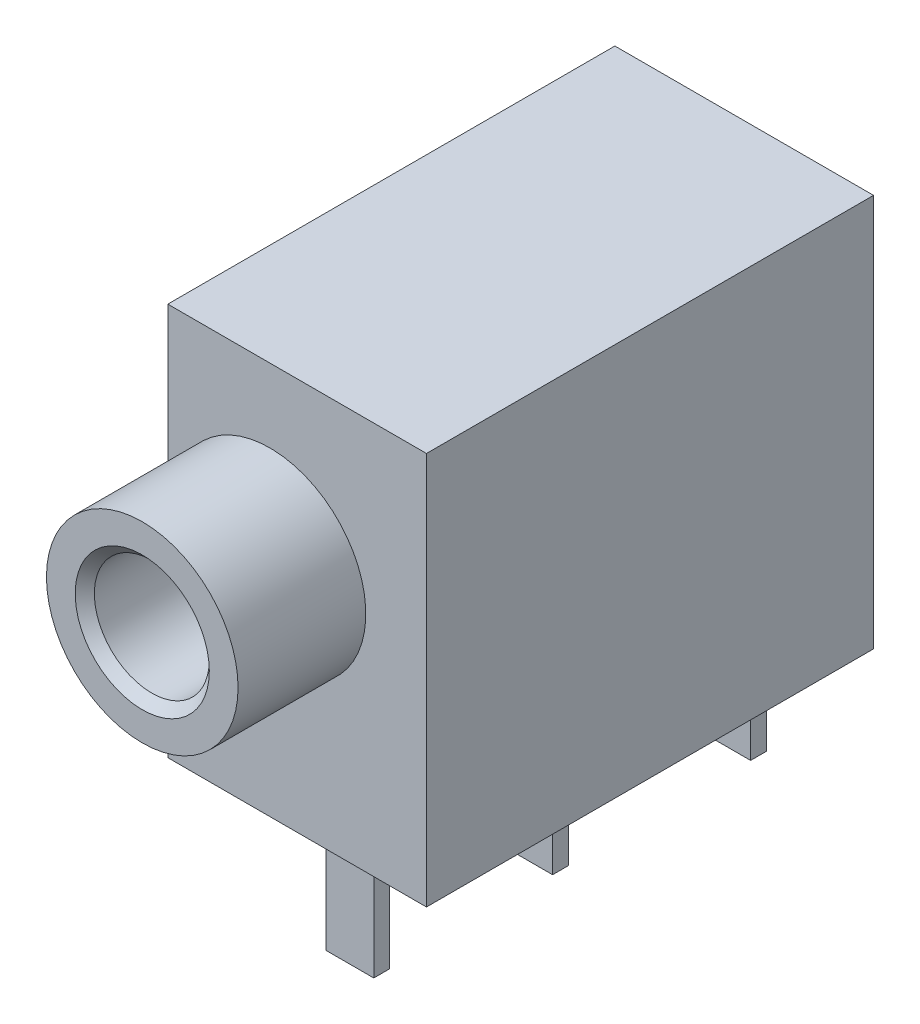
ISO-10303-21;
HEADER;
FILE_DESCRIPTION(('STEP AP214'),'2;1');
FILE_NAME('part.step','',(''),(''),'','','');
FILE_SCHEMA(('AUTOMOTIVE_DESIGN { 1 0 10303 214 1 1 1 1 }'));
ENDSEC;
DATA;
#1=APPLICATION_CONTEXT('core data for automotive mechanical design processes');
#2=APPLICATION_PROTOCOL_DEFINITION('international standard','automotive_design',2000,#1);
#3=PRODUCT_CONTEXT('',#1,'mechanical');
#4=PRODUCT('Part','Part','',(#3));
#5=PRODUCT_RELATED_PRODUCT_CATEGORY('part','',(#4));
#6=PRODUCT_DEFINITION_FORMATION('','',#4);
#7=PRODUCT_DEFINITION_CONTEXT('part definition',#1,'design');
#8=PRODUCT_DEFINITION('design','',#6,#7);
#9=PRODUCT_DEFINITION_SHAPE('','',#8);
#10=(LENGTH_UNIT() NAMED_UNIT(*) SI_UNIT(.MILLI.,.METRE.));
#11=(NAMED_UNIT(*) PLANE_ANGLE_UNIT() SI_UNIT($,.RADIAN.));
#12=(NAMED_UNIT(*) SI_UNIT($,.STERADIAN.) SOLID_ANGLE_UNIT());
#13=UNCERTAINTY_MEASURE_WITH_UNIT(LENGTH_MEASURE(1.E-05),#10,'distance_accuracy_value','');
#14=(GEOMETRIC_REPRESENTATION_CONTEXT(3) GLOBAL_UNCERTAINTY_ASSIGNED_CONTEXT((#13)) GLOBAL_UNIT_ASSIGNED_CONTEXT((#10,
#11,#12)) REPRESENTATION_CONTEXT('',''));
#15=CARTESIAN_POINT('',(0.,0.,0.));
#16=DIRECTION('',(0.,0.,1.));
#17=DIRECTION('',(1.,0.,0.));
#18=AXIS2_PLACEMENT_3D('',#15,#16,#17);
#19=CARTESIAN_POINT('',(-4.05,-6.15,7.));
#20=DIRECTION('',(0.,1.,0.));
#21=DIRECTION('',(0.,0.,1.));
#22=AXIS2_PLACEMENT_3D('',#19,#20,#21);
#23=PLANE('',#22);
#24=DIRECTION('',(0.,0.,-1.));
#25=VECTOR('',#24,1.);
#26=CARTESIAN_POINT('',(-1.85,-6.15,-3.05));
#27=LINE('',#26,#25);
#28=CARTESIAN_POINT('',(-1.85,-6.15,-3.05));
#29=VERTEX_POINT('',#28);
#30=CARTESIAN_POINT('',(-1.85,-6.15,-3.55));
#31=VERTEX_POINT('',#30);
#32=EDGE_CURVE('E215',#29,#31,#27,.T.);
#33=ORIENTED_EDGE('',*,*,#32,.F.);
#34=DIRECTION('',(-1.,0.,0.));
#35=VECTOR('',#34,1.);
#36=CARTESIAN_POINT('',(-1.85,-6.15,-3.05));
#37=LINE('',#36,#35);
#38=CARTESIAN_POINT('',(-0.35,-6.15,-3.05));
#39=VERTEX_POINT('',#38);
#40=EDGE_CURVE('E228',#39,#29,#37,.T.);
#41=ORIENTED_EDGE('',*,*,#40,.F.);
#42=DIRECTION('',(0.,0.,1.));
#43=VECTOR('',#42,1.);
#44=CARTESIAN_POINT('',(-0.35,-6.15,-3.05));
#45=LINE('',#44,#43);
#46=CARTESIAN_POINT('',(-0.35,-6.15,-3.55));
#47=VERTEX_POINT('',#46);
#48=EDGE_CURVE('E237',#47,#39,#45,.T.);
#49=ORIENTED_EDGE('',*,*,#48,.F.);
#50=DIRECTION('',(1.,0.,0.));
#51=VECTOR('',#50,1.);
#52=CARTESIAN_POINT('',(-1.85,-6.15,-3.55));
#53=LINE('',#52,#51);
#54=EDGE_CURVE('E218',#31,#47,#53,.T.);
#55=ORIENTED_EDGE('',*,*,#54,.F.);
#56=EDGE_LOOP('',(#33,#41,#49,#55));
#57=FACE_BOUND('',#56,.T.);
#58=DIRECTION('',(0.,0.,-1.));
#59=VECTOR('',#58,1.);
#60=CARTESIAN_POINT('',(-1.85,-6.15,2.55));
#61=LINE('',#60,#59);
#62=CARTESIAN_POINT('',(-1.85,-6.15,2.55));
#63=VERTEX_POINT('',#62);
#64=CARTESIAN_POINT('',(-1.85,-6.15,2.05));
#65=VERTEX_POINT('',#64);
#66=EDGE_CURVE('E286',#63,#65,#61,.T.);
#67=ORIENTED_EDGE('',*,*,#66,.F.);
#68=DIRECTION('',(-1.,0.,0.));
#69=VECTOR('',#68,1.);
#70=CARTESIAN_POINT('',(-1.85,-6.15,2.55));
#71=LINE('',#70,#69);
#72=CARTESIAN_POINT('',(-0.349999999999997,-6.15,2.55));
#73=VERTEX_POINT('',#72);
#74=EDGE_CURVE('E291',#73,#63,#71,.T.);
#75=ORIENTED_EDGE('',*,*,#74,.F.);
#76=DIRECTION('',(0.,0.,1.));
#77=VECTOR('',#76,1.);
#78=CARTESIAN_POINT('',(-0.349999999999997,-6.15,2.55));
#79=LINE('',#78,#77);
#80=CARTESIAN_POINT('',(-0.349999999999997,-6.15,2.05));
#81=VERTEX_POINT('',#80);
#82=EDGE_CURVE('E303',#81,#73,#79,.T.);
#83=ORIENTED_EDGE('',*,*,#82,.F.);
#84=DIRECTION('',(1.,0.,0.));
#85=VECTOR('',#84,1.);
#86=CARTESIAN_POINT('',(-1.85,-6.15,2.05));
#87=LINE('',#86,#85);
#88=EDGE_CURVE('E300',#65,#81,#87,.T.);
#89=ORIENTED_EDGE('',*,*,#88,.F.);
#90=EDGE_LOOP('',(#67,#75,#83,#89));
#91=FACE_BOUND('',#90,.T.);
#92=DIRECTION('',(1.,0.,0.));
#93=VECTOR('',#92,1.);
#94=CARTESIAN_POINT('',(-4.05,-6.15,-7.));
#95=LINE('',#94,#93);
#96=CARTESIAN_POINT('',(-4.05,-6.15,-7.));
#97=VERTEX_POINT('',#96);
#98=CARTESIAN_POINT('',(4.05,-6.15,-7.));
#99=VERTEX_POINT('',#98);
#100=EDGE_CURVE('E363',#97,#99,#95,.T.);
#101=ORIENTED_EDGE('',*,*,#100,.T.);
#102=DIRECTION('',(0.,0.,-1.));
#103=VECTOR('',#102,1.);
#104=CARTESIAN_POINT('',(4.05,-6.15,7.));
#105=LINE('',#104,#103);
#106=CARTESIAN_POINT('',(4.05,-6.15,7.));
#107=VERTEX_POINT('',#106);
#108=EDGE_CURVE('E369',#107,#99,#105,.T.);
#109=ORIENTED_EDGE('',*,*,#108,.F.);
#110=DIRECTION('',(1.,0.,0.));
#111=VECTOR('',#110,1.);
#112=CARTESIAN_POINT('',(-4.05,-6.15,7.));
#113=LINE('',#112,#111);
#114=CARTESIAN_POINT('',(-4.05,-6.15,7.));
#115=VERTEX_POINT('',#114);
#116=EDGE_CURVE('E367',#115,#107,#113,.T.);
#117=ORIENTED_EDGE('',*,*,#116,.F.);
#118=DIRECTION('',(0.,0.,-1.));
#119=VECTOR('',#118,1.);
#120=CARTESIAN_POINT('',(-4.05,-6.15,7.));
#121=LINE('',#120,#119);
#122=EDGE_CURVE('E379',#115,#97,#121,.T.);
#123=ORIENTED_EDGE('',*,*,#122,.T.);
#124=EDGE_LOOP('',(#101,#109,#117,#123));
#125=FACE_BOUND('',#124,.T.);
#126=DIRECTION('',(0.,0.,-1.));
#127=VECTOR('',#126,1.);
#128=CARTESIAN_POINT('',(0.149999999999999,-6.15,6.25));
#129=LINE('',#128,#127);
#130=CARTESIAN_POINT('',(0.149999999999999,-6.15,6.25));
#131=VERTEX_POINT('',#130);
#132=CARTESIAN_POINT('',(0.149999999999999,-6.15,5.75));
#133=VERTEX_POINT('',#132);
#134=EDGE_CURVE('E319',#131,#133,#129,.T.);
#135=ORIENTED_EDGE('',*,*,#134,.F.);
#136=DIRECTION('',(-1.,0.,0.));
#137=VECTOR('',#136,1.);
#138=CARTESIAN_POINT('',(0.149999999999999,-6.15,6.25));
#139=LINE('',#138,#137);
#140=CARTESIAN_POINT('',(1.65,-6.15,6.25));
#141=VERTEX_POINT('',#140);
#142=EDGE_CURVE('E324',#141,#131,#139,.T.);
#143=ORIENTED_EDGE('',*,*,#142,.F.);
#144=DIRECTION('',(0.,0.,1.));
#145=VECTOR('',#144,1.);
#146=CARTESIAN_POINT('',(1.65,-6.15,6.25));
#147=LINE('',#146,#145);
#148=CARTESIAN_POINT('',(1.65,-6.15,5.75));
#149=VERTEX_POINT('',#148);
#150=EDGE_CURVE('E336',#149,#141,#147,.T.);
#151=ORIENTED_EDGE('',*,*,#150,.F.);
#152=DIRECTION('',(1.,0.,0.));
#153=VECTOR('',#152,1.);
#154=CARTESIAN_POINT('',(0.149999999999999,-6.15,5.75));
#155=LINE('',#154,#153);
#156=EDGE_CURVE('E333',#133,#149,#155,.T.);
#157=ORIENTED_EDGE('',*,*,#156,.F.);
#158=EDGE_LOOP('',(#135,#143,#151,#157));
#159=FACE_BOUND('',#158,.T.);
#160=DIRECTION('',(0.,0.,-1.));
#161=VECTOR('',#160,1.);
#162=CARTESIAN_POINT('',(0.149999999999999,-6.15,0.649999999999999));
#163=LINE('',#162,#161);
#164=CARTESIAN_POINT('',(0.149999999999999,-6.15,0.649999999999999));
#165=VERTEX_POINT('',#164);
#166=CARTESIAN_POINT('',(0.149999999999998,-6.15,0.149999999999999));
#167=VERTEX_POINT('',#166);
#168=EDGE_CURVE('E253',#165,#167,#163,.T.);
#169=ORIENTED_EDGE('',*,*,#168,.F.);
#170=DIRECTION('',(-1.,0.,0.));
#171=VECTOR('',#170,1.);
#172=CARTESIAN_POINT('',(0.149999999999999,-6.15,0.649999999999999));
#173=LINE('',#172,#171);
#174=CARTESIAN_POINT('',(1.65,-6.15,0.65));
#175=VERTEX_POINT('',#174);
#176=EDGE_CURVE('E258',#175,#165,#173,.T.);
#177=ORIENTED_EDGE('',*,*,#176,.F.);
#178=DIRECTION('',(0.,0.,1.));
#179=VECTOR('',#178,1.);
#180=CARTESIAN_POINT('',(1.65,-6.15,0.649999999999999));
#181=LINE('',#180,#179);
#182=CARTESIAN_POINT('',(1.65,-6.15,0.149999999999998));
#183=VERTEX_POINT('',#182);
#184=EDGE_CURVE('E270',#183,#175,#181,.T.);
#185=ORIENTED_EDGE('',*,*,#184,.F.);
#186=DIRECTION('',(1.,0.,0.));
#187=VECTOR('',#186,1.);
#188=CARTESIAN_POINT('',(0.149999999999999,-6.15,0.149999999999999));
#189=LINE('',#188,#187);
#190=EDGE_CURVE('E267',#167,#183,#189,.T.);
#191=ORIENTED_EDGE('',*,*,#190,.F.);
#192=EDGE_LOOP('',(#169,#177,#185,#191));
#193=FACE_BOUND('',#192,.T.);
#194=DIRECTION('',(0.,0.,-1.));
#195=VECTOR('',#194,1.);
#196=CARTESIAN_POINT('',(0.150000000000001,-6.15,-5.55));
#197=LINE('',#196,#195);
#198=CARTESIAN_POINT('',(0.150000000000001,-6.15,-5.55));
#199=VERTEX_POINT('',#198);
#200=CARTESIAN_POINT('',(0.150000000000001,-6.15,-6.05));
#201=VERTEX_POINT('',#200);
#202=EDGE_CURVE('E214',#199,#201,#197,.T.);
#203=ORIENTED_EDGE('',*,*,#202,.F.);
#204=DIRECTION('',(-1.,0.,0.));
#205=VECTOR('',#204,1.);
#206=CARTESIAN_POINT('',(0.150000000000001,-6.15,-5.55));
#207=LINE('',#206,#205);
#208=CARTESIAN_POINT('',(1.65,-6.15,-5.55));
#209=VERTEX_POINT('',#208);
#210=EDGE_CURVE('E211',#209,#199,#207,.T.);
#211=ORIENTED_EDGE('',*,*,#210,.F.);
#212=DIRECTION('',(0.,0.,1.));
#213=VECTOR('',#212,1.);
#214=CARTESIAN_POINT('',(1.65,-6.15,-5.55));
#215=LINE('',#214,#213);
#216=CARTESIAN_POINT('',(1.65,-6.15,-6.05));
#217=VERTEX_POINT('',#216);
#218=EDGE_CURVE('E53',#217,#209,#215,.T.);
#219=ORIENTED_EDGE('',*,*,#218,.F.);
#220=DIRECTION('',(1.,0.,0.));
#221=VECTOR('',#220,1.);
#222=CARTESIAN_POINT('',(0.150000000000001,-6.15,-6.05));
#223=LINE('',#222,#221);
#224=EDGE_CURVE('E48',#201,#217,#223,.T.);
#225=ORIENTED_EDGE('',*,*,#224,.F.);
#226=EDGE_LOOP('',(#203,#211,#219,#225));
#227=FACE_BOUND('',#226,.T.);
#228=ADVANCED_FACE('F33',(#57,#91,#125,#159,#193,#227),#23,.F.);
#229=CARTESIAN_POINT('',(4.05,-6.15,7.));
#230=DIRECTION('',(-1.,0.,0.));
#231=DIRECTION('',(0.,0.,1.));
#232=AXIS2_PLACEMENT_3D('',#229,#230,#231);
#233=PLANE('',#232);
#234=DIRECTION('',(0.,1.,0.));
#235=VECTOR('',#234,1.);
#236=CARTESIAN_POINT('',(4.05,-6.15,-7.));
#237=LINE('',#236,#235);
#238=CARTESIAN_POINT('',(4.05,6.15,-7.));
#239=VERTEX_POINT('',#238);
#240=EDGE_CURVE('E358',#99,#239,#237,.T.);
#241=ORIENTED_EDGE('',*,*,#240,.T.);
#242=DIRECTION('',(0.,0.,-1.));
#243=VECTOR('',#242,1.);
#244=CARTESIAN_POINT('',(4.05,6.15,7.));
#245=LINE('',#244,#243);
#246=CARTESIAN_POINT('',(4.05,6.15,7.));
#247=VERTEX_POINT('',#246);
#248=EDGE_CURVE('E385',#247,#239,#245,.T.);
#249=ORIENTED_EDGE('',*,*,#248,.F.);
#250=DIRECTION('',(0.,1.,0.));
#251=VECTOR('',#250,1.);
#252=CARTESIAN_POINT('',(4.05,-6.15,7.));
#253=LINE('',#252,#251);
#254=EDGE_CURVE('E359',#107,#247,#253,.T.);
#255=ORIENTED_EDGE('',*,*,#254,.F.);
#256=ORIENTED_EDGE('',*,*,#108,.T.);
#257=EDGE_LOOP('',(#241,#249,#255,#256));
#258=FACE_BOUND('',#257,.T.);
#259=ADVANCED_FACE('F411',(#258),#233,.F.);
#260=CARTESIAN_POINT('',(-4.05,6.15,7.));
#261=DIRECTION('',(0.,-1.,0.));
#262=DIRECTION('',(0.,0.,-1.));
#263=AXIS2_PLACEMENT_3D('',#260,#261,#262);
#264=PLANE('',#263);
#265=DIRECTION('',(-1.,0.,0.));
#266=VECTOR('',#265,1.);
#267=CARTESIAN_POINT('',(-4.05,6.15,-7.));
#268=LINE('',#267,#266);
#269=CARTESIAN_POINT('',(-4.05,6.15,-7.));
#270=VERTEX_POINT('',#269);
#271=EDGE_CURVE('E372',#239,#270,#268,.T.);
#272=ORIENTED_EDGE('',*,*,#271,.T.);
#273=DIRECTION('',(0.,0.,-1.));
#274=VECTOR('',#273,1.);
#275=CARTESIAN_POINT('',(-4.05,6.15,7.));
#276=LINE('',#275,#274);
#277=CARTESIAN_POINT('',(-4.05,6.15,7.));
#278=VERTEX_POINT('',#277);
#279=EDGE_CURVE('E382',#278,#270,#276,.T.);
#280=ORIENTED_EDGE('',*,*,#279,.F.);
#281=DIRECTION('',(-1.,0.,0.));
#282=VECTOR('',#281,1.);
#283=CARTESIAN_POINT('',(-4.05,6.15,7.));
#284=LINE('',#283,#282);
#285=EDGE_CURVE('E362',#247,#278,#284,.T.);
#286=ORIENTED_EDGE('',*,*,#285,.F.);
#287=ORIENTED_EDGE('',*,*,#248,.T.);
#288=EDGE_LOOP('',(#272,#280,#286,#287));
#289=FACE_BOUND('',#288,.T.);
#290=ADVANCED_FACE('F417',(#289),#264,.F.);
#291=CARTESIAN_POINT('',(-4.05,-6.15,7.));
#292=DIRECTION('',(1.,0.,0.));
#293=DIRECTION('',(0.,0.,-1.));
#294=AXIS2_PLACEMENT_3D('',#291,#292,#293);
#295=PLANE('',#294);
#296=DIRECTION('',(0.,-1.,0.));
#297=VECTOR('',#296,1.);
#298=CARTESIAN_POINT('',(-4.05,-6.15,-7.));
#299=LINE('',#298,#297);
#300=EDGE_CURVE('E374',#270,#97,#299,.T.);
#301=ORIENTED_EDGE('',*,*,#300,.T.);
#302=ORIENTED_EDGE('',*,*,#122,.F.);
#303=DIRECTION('',(0.,-1.,0.));
#304=VECTOR('',#303,1.);
#305=CARTESIAN_POINT('',(-4.05,-6.15,7.));
#306=LINE('',#305,#304);
#307=EDGE_CURVE('E365',#278,#115,#306,.T.);
#308=ORIENTED_EDGE('',*,*,#307,.F.);
#309=ORIENTED_EDGE('',*,*,#279,.T.);
#310=EDGE_LOOP('',(#301,#302,#308,#309));
#311=FACE_BOUND('',#310,.T.);
#312=ADVANCED_FACE('F424',(#311),#295,.F.);
#313=CARTESIAN_POINT('',(0.,0.,7.));
#314=DIRECTION('',(0.,0.,-1.));
#315=DIRECTION('',(-1.,0.,0.));
#316=AXIS2_PLACEMENT_3D('',#313,#314,#315);
#317=PLANE('',#316);
#318=CARTESIAN_POINT('',(-0.85,0.849999999999999,7.));
#319=DIRECTION('',(0.,0.,-1.));
#320=DIRECTION('',(-1.,0.,0.));
#321=AXIS2_PLACEMENT_3D('',#318,#319,#320);
#322=CIRCLE('',#321,3.);
#323=CARTESIAN_POINT('',(-3.85,0.849999999999999,7.));
#324=VERTEX_POINT('',#323);
#325=EDGE_CURVE('E388',#324,#324,#322,.F.);
#326=ORIENTED_EDGE('',*,*,#325,.F.);
#327=EDGE_LOOP('',(#326));
#328=FACE_BOUND('',#327,.T.);
#329=ORIENTED_EDGE('',*,*,#254,.T.);
#330=ORIENTED_EDGE('',*,*,#285,.T.);
#331=ORIENTED_EDGE('',*,*,#307,.T.);
#332=ORIENTED_EDGE('',*,*,#116,.T.);
#333=EDGE_LOOP('',(#329,#330,#331,#332));
#334=FACE_BOUND('',#333,.T.);
#335=ADVANCED_FACE('F427',(#328,#334),#317,.F.);
#336=CARTESIAN_POINT('',(0.,0.,-7.));
#337=DIRECTION('',(0.,0.,-1.));
#338=DIRECTION('',(-1.,0.,0.));
#339=AXIS2_PLACEMENT_3D('',#336,#337,#338);
#340=PLANE('',#339);
#341=ORIENTED_EDGE('',*,*,#240,.F.);
#342=ORIENTED_EDGE('',*,*,#100,.F.);
#343=ORIENTED_EDGE('',*,*,#300,.F.);
#344=ORIENTED_EDGE('',*,*,#271,.F.);
#345=EDGE_LOOP('',(#341,#342,#343,#344));
#346=FACE_BOUND('',#345,.T.);
#347=ADVANCED_FACE('F422',(#346),#340,.T.);
#348=CARTESIAN_POINT('',(-0.85,0.849999999999999,11.));
#349=DIRECTION('',(0.,0.,-1.));
#350=DIRECTION('',(-1.,0.,0.));
#351=AXIS2_PLACEMENT_3D('',#348,#349,#350);
#352=CYLINDRICAL_SURFACE('',#351,3.);
#353=CARTESIAN_POINT('',(-0.85,0.849999999999999,11.));
#354=DIRECTION('',(0.,0.,1.));
#355=DIRECTION('',(1.,0.,0.));
#356=AXIS2_PLACEMENT_3D('',#353,#354,#355);
#357=CIRCLE('',#356,3.);
#358=CARTESIAN_POINT('',(2.15,0.849999999999999,11.));
#359=VERTEX_POINT('',#358);
#360=EDGE_CURVE('E355',#359,#359,#357,.T.);
#361=ORIENTED_EDGE('',*,*,#360,.F.);
#362=EDGE_LOOP('',(#361));
#363=FACE_BOUND('',#362,.T.);
#364=ORIENTED_EDGE('',*,*,#325,.T.);
#365=EDGE_LOOP('',(#364));
#366=FACE_BOUND('',#365,.T.);
#367=ADVANCED_FACE('F452',(#363,#366),#352,.T.);
#368=CARTESIAN_POINT('',(-0.85,0.849999999999999,11.));
#369=DIRECTION('',(0.,0.,1.));
#370=DIRECTION('',(1.,0.,0.));
#371=AXIS2_PLACEMENT_3D('',#368,#369,#370);
#372=PLANE('',#371);
#373=CARTESIAN_POINT('',(-0.85,0.849999999999999,11.));
#374=DIRECTION('',(0.,0.,1.));
#375=DIRECTION('',(1.,0.,0.));
#376=AXIS2_PLACEMENT_3D('',#373,#374,#375);
#377=CIRCLE('',#376,2.1);
#378=CARTESIAN_POINT('',(1.25000000000001,0.849999999999999,11.));
#379=VERTEX_POINT('',#378);
#380=EDGE_CURVE('E11',#379,#379,#377,.F.);
#381=ORIENTED_EDGE('',*,*,#380,.T.);
#382=EDGE_LOOP('',(#381));
#383=FACE_BOUND('',#382,.T.);
#384=ORIENTED_EDGE('',*,*,#360,.T.);
#385=EDGE_LOOP('',(#384));
#386=FACE_BOUND('',#385,.T.);
#387=ADVANCED_FACE('F457',(#383,#386),#372,.T.);
#388=CARTESIAN_POINT('',(-0.85,0.849999999999999,-3.));
#389=DIRECTION('',(0.,0.,1.));
#390=DIRECTION('',(1.,0.,0.));
#391=AXIS2_PLACEMENT_3D('',#388,#389,#390);
#392=CYLINDRICAL_SURFACE('',#391,1.8);
#393=CARTESIAN_POINT('',(-0.85,0.849999999999999,10.7));
#394=DIRECTION('',(0.,0.,1.));
#395=DIRECTION('',(1.,0.,0.));
#396=AXIS2_PLACEMENT_3D('',#393,#394,#395);
#397=CIRCLE('',#396,1.8);
#398=CARTESIAN_POINT('',(0.95,0.849999999999999,10.7));
#399=VERTEX_POINT('',#398);
#400=EDGE_CURVE('E41',#399,#399,#397,.T.);
#401=ORIENTED_EDGE('',*,*,#400,.T.);
#402=EDGE_LOOP('',(#401));
#403=FACE_BOUND('',#402,.T.);
#404=CARTESIAN_POINT('',(-0.85,0.849999999999999,-3.));
#405=DIRECTION('',(0.,0.,1.));
#406=DIRECTION('',(1.,0.,0.));
#407=AXIS2_PLACEMENT_3D('',#404,#405,#406);
#408=CIRCLE('',#407,1.8);
#409=CARTESIAN_POINT('',(0.95,0.849999999999999,-3.));
#410=VERTEX_POINT('',#409);
#411=EDGE_CURVE('E352',#410,#410,#408,.T.);
#412=ORIENTED_EDGE('',*,*,#411,.F.);
#413=EDGE_LOOP('',(#412));
#414=FACE_BOUND('',#413,.T.);
#415=ADVANCED_FACE('F393',(#403,#414),#392,.F.);
#416=CARTESIAN_POINT('',(-0.85,0.849999999999999,-3.));
#417=DIRECTION('',(0.,0.,1.));
#418=DIRECTION('',(1.,0.,0.));
#419=AXIS2_PLACEMENT_3D('',#416,#417,#418);
#420=PLANE('',#419);
#421=ORIENTED_EDGE('',*,*,#411,.T.);
#422=EDGE_LOOP('',(#421));
#423=FACE_BOUND('',#422,.T.);
#424=ADVANCED_FACE('F398',(#423),#420,.T.);
#425=CARTESIAN_POINT('',(-0.85,0.849999999999999,10.7));
#426=DIRECTION('',(0.,0.,1.));
#427=DIRECTION('',(1.,0.,0.));
#428=AXIS2_PLACEMENT_3D('',#425,#426,#427);
#429=CONICAL_SURFACE('',#428,1.8,0.785398163397454);
#430=ORIENTED_EDGE('',*,*,#380,.F.);
#431=EDGE_LOOP('',(#430));
#432=FACE_BOUND('',#431,.T.);
#433=ORIENTED_EDGE('',*,*,#400,.F.);
#434=EDGE_LOOP('',(#433));
#435=FACE_BOUND('',#434,.T.);
#436=ADVANCED_FACE('F35',(#432,#435),#429,.F.);
#437=CARTESIAN_POINT('',(0.149999999999999,-9.65,6.25));
#438=DIRECTION('',(1.,0.,0.));
#439=DIRECTION('',(0.,0.,-1.));
#440=AXIS2_PLACEMENT_3D('',#437,#438,#439);
#441=PLANE('',#440);
#442=ORIENTED_EDGE('',*,*,#134,.T.);
#443=DIRECTION('',(0.,1.,0.));
#444=VECTOR('',#443,1.);
#445=CARTESIAN_POINT('',(0.149999999999999,-9.65,5.75));
#446=LINE('',#445,#444);
#447=CARTESIAN_POINT('',(0.149999999999999,-9.65,5.75));
#448=VERTEX_POINT('',#447);
#449=EDGE_CURVE('E349',#448,#133,#446,.T.);
#450=ORIENTED_EDGE('',*,*,#449,.F.);
#451=DIRECTION('',(0.,0.,-1.));
#452=VECTOR('',#451,1.);
#453=CARTESIAN_POINT('',(0.149999999999999,-9.65,6.25));
#454=LINE('',#453,#452);
#455=CARTESIAN_POINT('',(0.149999999999999,-9.65,6.25));
#456=VERTEX_POINT('',#455);
#457=EDGE_CURVE('E320',#456,#448,#454,.T.);
#458=ORIENTED_EDGE('',*,*,#457,.F.);
#459=DIRECTION('',(0.,1.,0.));
#460=VECTOR('',#459,1.);
#461=CARTESIAN_POINT('',(0.149999999999999,-9.65,6.25));
#462=LINE('',#461,#460);
#463=EDGE_CURVE('E330',#456,#131,#462,.T.);
#464=ORIENTED_EDGE('',*,*,#463,.T.);
#465=EDGE_LOOP('',(#442,#450,#458,#464));
#466=FACE_BOUND('',#465,.T.);
#467=ADVANCED_FACE('F397',(#466),#441,.F.);
#468=CARTESIAN_POINT('',(0.149999999999999,-9.65,5.75));
#469=DIRECTION('',(0.,0.,1.));
#470=DIRECTION('',(1.,0.,0.));
#471=AXIS2_PLACEMENT_3D('',#468,#469,#470);
#472=PLANE('',#471);
#473=ORIENTED_EDGE('',*,*,#156,.T.);
#474=DIRECTION('',(0.,1.,0.));
#475=VECTOR('',#474,1.);
#476=CARTESIAN_POINT('',(1.65,-9.65,5.75));
#477=LINE('',#476,#475);
#478=CARTESIAN_POINT('',(1.65,-9.65,5.75));
#479=VERTEX_POINT('',#478);
#480=EDGE_CURVE('E346',#479,#149,#477,.T.);
#481=ORIENTED_EDGE('',*,*,#480,.F.);
#482=DIRECTION('',(1.,0.,0.));
#483=VECTOR('',#482,1.);
#484=CARTESIAN_POINT('',(0.149999999999999,-9.65,5.75));
#485=LINE('',#484,#483);
#486=EDGE_CURVE('E323',#448,#479,#485,.T.);
#487=ORIENTED_EDGE('',*,*,#486,.F.);
#488=ORIENTED_EDGE('',*,*,#449,.T.);
#489=EDGE_LOOP('',(#473,#481,#487,#488));
#490=FACE_BOUND('',#489,.T.);
#491=ADVANCED_FACE('F404',(#490),#472,.F.);
#492=CARTESIAN_POINT('',(1.65,-9.65,6.25));
#493=DIRECTION('',(-1.,0.,0.));
#494=DIRECTION('',(0.,0.,1.));
#495=AXIS2_PLACEMENT_3D('',#492,#493,#494);
#496=PLANE('',#495);
#497=ORIENTED_EDGE('',*,*,#150,.T.);
#498=DIRECTION('',(0.,1.,0.));
#499=VECTOR('',#498,1.);
#500=CARTESIAN_POINT('',(1.65,-9.65,6.25));
#501=LINE('',#500,#499);
#502=CARTESIAN_POINT('',(1.65,-9.65,6.25));
#503=VERTEX_POINT('',#502);
#504=EDGE_CURVE('E343',#503,#141,#501,.T.);
#505=ORIENTED_EDGE('',*,*,#504,.F.);
#506=DIRECTION('',(0.,0.,1.));
#507=VECTOR('',#506,1.);
#508=CARTESIAN_POINT('',(1.65,-9.65,6.25));
#509=LINE('',#508,#507);
#510=EDGE_CURVE('E326',#479,#503,#509,.T.);
#511=ORIENTED_EDGE('',*,*,#510,.F.);
#512=ORIENTED_EDGE('',*,*,#480,.T.);
#513=EDGE_LOOP('',(#497,#505,#511,#512));
#514=FACE_BOUND('',#513,.T.);
#515=ADVANCED_FACE('F466',(#514),#496,.F.);
#516=CARTESIAN_POINT('',(0.149999999999999,-9.65,6.25));
#517=DIRECTION('',(0.,0.,-1.));
#518=DIRECTION('',(-1.,0.,0.));
#519=AXIS2_PLACEMENT_3D('',#516,#517,#518);
#520=PLANE('',#519);
#521=ORIENTED_EDGE('',*,*,#142,.T.);
#522=ORIENTED_EDGE('',*,*,#463,.F.);
#523=DIRECTION('',(-1.,0.,0.));
#524=VECTOR('',#523,1.);
#525=CARTESIAN_POINT('',(0.149999999999999,-9.65,6.25));
#526=LINE('',#525,#524);
#527=EDGE_CURVE('E328',#503,#456,#526,.T.);
#528=ORIENTED_EDGE('',*,*,#527,.F.);
#529=ORIENTED_EDGE('',*,*,#504,.T.);
#530=EDGE_LOOP('',(#521,#522,#528,#529));
#531=FACE_BOUND('',#530,.T.);
#532=ADVANCED_FACE('F470',(#531),#520,.F.);
#533=CARTESIAN_POINT('',(0.,-9.65,0.));
#534=DIRECTION('',(0.,-1.,0.));
#535=DIRECTION('',(0.,0.,-1.));
#536=AXIS2_PLACEMENT_3D('',#533,#534,#535);
#537=PLANE('',#536);
#538=ORIENTED_EDGE('',*,*,#457,.T.);
#539=ORIENTED_EDGE('',*,*,#486,.T.);
#540=ORIENTED_EDGE('',*,*,#510,.T.);
#541=ORIENTED_EDGE('',*,*,#527,.T.);
#542=EDGE_LOOP('',(#538,#539,#540,#541));
#543=FACE_BOUND('',#542,.T.);
#544=ADVANCED_FACE('F474',(#543),#537,.T.);
#545=CARTESIAN_POINT('',(-1.85,-9.65,2.55));
#546=DIRECTION('',(1.,0.,0.));
#547=DIRECTION('',(0.,0.,-1.));
#548=AXIS2_PLACEMENT_3D('',#545,#546,#547);
#549=PLANE('',#548);
#550=ORIENTED_EDGE('',*,*,#66,.T.);
#551=DIRECTION('',(0.,1.,0.));
#552=VECTOR('',#551,1.);
#553=CARTESIAN_POINT('',(-1.85,-9.65,2.05));
#554=LINE('',#553,#552);
#555=CARTESIAN_POINT('',(-1.85,-9.65,2.05));
#556=VERTEX_POINT('',#555);
#557=EDGE_CURVE('E316',#556,#65,#554,.T.);
#558=ORIENTED_EDGE('',*,*,#557,.F.);
#559=DIRECTION('',(0.,0.,-1.));
#560=VECTOR('',#559,1.);
#561=CARTESIAN_POINT('',(-1.85,-9.65,2.55));
#562=LINE('',#561,#560);
#563=CARTESIAN_POINT('',(-1.85,-9.65,2.55));
#564=VERTEX_POINT('',#563);
#565=EDGE_CURVE('E287',#564,#556,#562,.T.);
#566=ORIENTED_EDGE('',*,*,#565,.F.);
#567=DIRECTION('',(0.,1.,0.));
#568=VECTOR('',#567,1.);
#569=CARTESIAN_POINT('',(-1.85,-9.65,2.55));
#570=LINE('',#569,#568);
#571=EDGE_CURVE('E297',#564,#63,#570,.T.);
#572=ORIENTED_EDGE('',*,*,#571,.T.);
#573=EDGE_LOOP('',(#550,#558,#566,#572));
#574=FACE_BOUND('',#573,.T.);
#575=ADVANCED_FACE('F478',(#574),#549,.F.);
#576=CARTESIAN_POINT('',(-1.85,-9.65,2.05));
#577=DIRECTION('',(0.,0.,1.));
#578=DIRECTION('',(1.,0.,0.));
#579=AXIS2_PLACEMENT_3D('',#576,#577,#578);
#580=PLANE('',#579);
#581=ORIENTED_EDGE('',*,*,#88,.T.);
#582=DIRECTION('',(0.,1.,0.));
#583=VECTOR('',#582,1.);
#584=CARTESIAN_POINT('',(-0.349999999999997,-9.65,2.05));
#585=LINE('',#584,#583);
#586=CARTESIAN_POINT('',(-0.349999999999997,-9.65,2.05));
#587=VERTEX_POINT('',#586);
#588=EDGE_CURVE('E313',#587,#81,#585,.T.);
#589=ORIENTED_EDGE('',*,*,#588,.F.);
#590=DIRECTION('',(1.,0.,0.));
#591=VECTOR('',#590,1.);
#592=CARTESIAN_POINT('',(-1.85,-9.65,2.05));
#593=LINE('',#592,#591);
#594=EDGE_CURVE('E290',#556,#587,#593,.T.);
#595=ORIENTED_EDGE('',*,*,#594,.F.);
#596=ORIENTED_EDGE('',*,*,#557,.T.);
#597=EDGE_LOOP('',(#581,#589,#595,#596));
#598=FACE_BOUND('',#597,.T.);
#599=ADVANCED_FACE('F482',(#598),#580,.F.);
#600=CARTESIAN_POINT('',(-0.349999999999997,-9.65,2.55));
#601=DIRECTION('',(-1.,0.,0.));
#602=DIRECTION('',(0.,0.,1.));
#603=AXIS2_PLACEMENT_3D('',#600,#601,#602);
#604=PLANE('',#603);
#605=ORIENTED_EDGE('',*,*,#82,.T.);
#606=DIRECTION('',(0.,1.,0.));
#607=VECTOR('',#606,1.);
#608=CARTESIAN_POINT('',(-0.349999999999997,-9.65,2.55));
#609=LINE('',#608,#607);
#610=CARTESIAN_POINT('',(-0.349999999999997,-9.65,2.55));
#611=VERTEX_POINT('',#610);
#612=EDGE_CURVE('E310',#611,#73,#609,.T.);
#613=ORIENTED_EDGE('',*,*,#612,.F.);
#614=DIRECTION('',(0.,0.,1.));
#615=VECTOR('',#614,1.);
#616=CARTESIAN_POINT('',(-0.349999999999997,-9.65,2.55));
#617=LINE('',#616,#615);
#618=EDGE_CURVE('E293',#587,#611,#617,.T.);
#619=ORIENTED_EDGE('',*,*,#618,.F.);
#620=ORIENTED_EDGE('',*,*,#588,.T.);
#621=EDGE_LOOP('',(#605,#613,#619,#620));
#622=FACE_BOUND('',#621,.T.);
#623=ADVANCED_FACE('F486',(#622),#604,.F.);
#624=CARTESIAN_POINT('',(-1.85,-9.65,2.55));
#625=DIRECTION('',(0.,0.,-1.));
#626=DIRECTION('',(-1.,0.,0.));
#627=AXIS2_PLACEMENT_3D('',#624,#625,#626);
#628=PLANE('',#627);
#629=ORIENTED_EDGE('',*,*,#74,.T.);
#630=ORIENTED_EDGE('',*,*,#571,.F.);
#631=DIRECTION('',(-1.,0.,0.));
#632=VECTOR('',#631,1.);
#633=CARTESIAN_POINT('',(-1.85,-9.65,2.55));
#634=LINE('',#633,#632);
#635=EDGE_CURVE('E295',#611,#564,#634,.T.);
#636=ORIENTED_EDGE('',*,*,#635,.F.);
#637=ORIENTED_EDGE('',*,*,#612,.T.);
#638=EDGE_LOOP('',(#629,#630,#636,#637));
#639=FACE_BOUND('',#638,.T.);
#640=ADVANCED_FACE('F490',(#639),#628,.F.);
#641=CARTESIAN_POINT('',(0.,-9.65,0.));
#642=DIRECTION('',(0.,-1.,0.));
#643=DIRECTION('',(0.,0.,-1.));
#644=AXIS2_PLACEMENT_3D('',#641,#642,#643);
#645=PLANE('',#644);
#646=ORIENTED_EDGE('',*,*,#565,.T.);
#647=ORIENTED_EDGE('',*,*,#594,.T.);
#648=ORIENTED_EDGE('',*,*,#618,.T.);
#649=ORIENTED_EDGE('',*,*,#635,.T.);
#650=EDGE_LOOP('',(#646,#647,#648,#649));
#651=FACE_BOUND('',#650,.T.);
#652=ADVANCED_FACE('F494',(#651),#645,.T.);
#653=CARTESIAN_POINT('',(0.149999999999999,-9.65,0.649999999999999));
#654=DIRECTION('',(1.,0.,0.));
#655=DIRECTION('',(0.,0.,-1.));
#656=AXIS2_PLACEMENT_3D('',#653,#654,#655);
#657=PLANE('',#656);
#658=ORIENTED_EDGE('',*,*,#168,.T.);
#659=DIRECTION('',(0.,1.,0.));
#660=VECTOR('',#659,1.);
#661=CARTESIAN_POINT('',(0.149999999999999,-9.65,0.149999999999999));
#662=LINE('',#661,#660);
#663=CARTESIAN_POINT('',(0.149999999999999,-9.65,0.149999999999999));
#664=VERTEX_POINT('',#663);
#665=EDGE_CURVE('E283',#664,#167,#662,.T.);
#666=ORIENTED_EDGE('',*,*,#665,.F.);
#667=DIRECTION('',(0.,0.,-1.));
#668=VECTOR('',#667,1.);
#669=CARTESIAN_POINT('',(0.149999999999999,-9.65,0.649999999999999));
#670=LINE('',#669,#668);
#671=CARTESIAN_POINT('',(0.149999999999999,-9.65,0.649999999999999));
#672=VERTEX_POINT('',#671);
#673=EDGE_CURVE('E254',#672,#664,#670,.T.);
#674=ORIENTED_EDGE('',*,*,#673,.F.);
#675=DIRECTION('',(0.,1.,0.));
#676=VECTOR('',#675,1.);
#677=CARTESIAN_POINT('',(0.149999999999999,-9.65,0.649999999999999));
#678=LINE('',#677,#676);
#679=EDGE_CURVE('E264',#672,#165,#678,.T.);
#680=ORIENTED_EDGE('',*,*,#679,.T.);
#681=EDGE_LOOP('',(#658,#666,#674,#680));
#682=FACE_BOUND('',#681,.T.);
#683=ADVANCED_FACE('F498',(#682),#657,.F.);
#684=CARTESIAN_POINT('',(0.149999999999999,-9.65,0.149999999999999));
#685=DIRECTION('',(0.,0.,1.));
#686=DIRECTION('',(1.,0.,0.));
#687=AXIS2_PLACEMENT_3D('',#684,#685,#686);
#688=PLANE('',#687);
#689=ORIENTED_EDGE('',*,*,#190,.T.);
#690=DIRECTION('',(0.,1.,0.));
#691=VECTOR('',#690,1.);
#692=CARTESIAN_POINT('',(1.65,-9.65,0.149999999999999));
#693=LINE('',#692,#691);
#694=CARTESIAN_POINT('',(1.65,-9.65,0.149999999999999));
#695=VERTEX_POINT('',#694);
#696=EDGE_CURVE('E280',#695,#183,#693,.T.);
#697=ORIENTED_EDGE('',*,*,#696,.F.);
#698=DIRECTION('',(1.,0.,0.));
#699=VECTOR('',#698,1.);
#700=CARTESIAN_POINT('',(0.149999999999999,-9.65,0.149999999999999));
#701=LINE('',#700,#699);
#702=EDGE_CURVE('E257',#664,#695,#701,.T.);
#703=ORIENTED_EDGE('',*,*,#702,.F.);
#704=ORIENTED_EDGE('',*,*,#665,.T.);
#705=EDGE_LOOP('',(#689,#697,#703,#704));
#706=FACE_BOUND('',#705,.T.);
#707=ADVANCED_FACE('F502',(#706),#688,.F.);
#708=CARTESIAN_POINT('',(1.65,-9.65,0.649999999999999));
#709=DIRECTION('',(-1.,0.,0.));
#710=DIRECTION('',(0.,0.,1.));
#711=AXIS2_PLACEMENT_3D('',#708,#709,#710);
#712=PLANE('',#711);
#713=ORIENTED_EDGE('',*,*,#184,.T.);
#714=DIRECTION('',(0.,1.,0.));
#715=VECTOR('',#714,1.);
#716=CARTESIAN_POINT('',(1.65,-9.65,0.649999999999999));
#717=LINE('',#716,#715);
#718=CARTESIAN_POINT('',(1.65,-9.65,0.649999999999999));
#719=VERTEX_POINT('',#718);
#720=EDGE_CURVE('E277',#719,#175,#717,.T.);
#721=ORIENTED_EDGE('',*,*,#720,.F.);
#722=DIRECTION('',(0.,0.,1.));
#723=VECTOR('',#722,1.);
#724=CARTESIAN_POINT('',(1.65,-9.65,0.649999999999999));
#725=LINE('',#724,#723);
#726=EDGE_CURVE('E260',#695,#719,#725,.T.);
#727=ORIENTED_EDGE('',*,*,#726,.F.);
#728=ORIENTED_EDGE('',*,*,#696,.T.);
#729=EDGE_LOOP('',(#713,#721,#727,#728));
#730=FACE_BOUND('',#729,.T.);
#731=ADVANCED_FACE('F506',(#730),#712,.F.);
#732=CARTESIAN_POINT('',(0.149999999999999,-9.65,0.649999999999999));
#733=DIRECTION('',(0.,0.,-1.));
#734=DIRECTION('',(-1.,0.,0.));
#735=AXIS2_PLACEMENT_3D('',#732,#733,#734);
#736=PLANE('',#735);
#737=ORIENTED_EDGE('',*,*,#176,.T.);
#738=ORIENTED_EDGE('',*,*,#679,.F.);
#739=DIRECTION('',(-1.,0.,0.));
#740=VECTOR('',#739,1.);
#741=CARTESIAN_POINT('',(0.149999999999999,-9.65,0.649999999999999));
#742=LINE('',#741,#740);
#743=EDGE_CURVE('E262',#719,#672,#742,.T.);
#744=ORIENTED_EDGE('',*,*,#743,.F.);
#745=ORIENTED_EDGE('',*,*,#720,.T.);
#746=EDGE_LOOP('',(#737,#738,#744,#745));
#747=FACE_BOUND('',#746,.T.);
#748=ADVANCED_FACE('F510',(#747),#736,.F.);
#749=CARTESIAN_POINT('',(0.,-9.65,0.));
#750=DIRECTION('',(0.,-1.,0.));
#751=DIRECTION('',(0.,0.,-1.));
#752=AXIS2_PLACEMENT_3D('',#749,#750,#751);
#753=PLANE('',#752);
#754=ORIENTED_EDGE('',*,*,#673,.T.);
#755=ORIENTED_EDGE('',*,*,#702,.T.);
#756=ORIENTED_EDGE('',*,*,#726,.T.);
#757=ORIENTED_EDGE('',*,*,#743,.T.);
#758=EDGE_LOOP('',(#754,#755,#756,#757));
#759=FACE_BOUND('',#758,.T.);
#760=ADVANCED_FACE('F514',(#759),#753,.T.);
#761=CARTESIAN_POINT('',(-1.85,-9.65,-3.05));
#762=DIRECTION('',(1.,0.,0.));
#763=DIRECTION('',(0.,0.,-1.));
#764=AXIS2_PLACEMENT_3D('',#761,#762,#763);
#765=PLANE('',#764);
#766=ORIENTED_EDGE('',*,*,#32,.T.);
#767=DIRECTION('',(0.,1.,0.));
#768=VECTOR('',#767,1.);
#769=CARTESIAN_POINT('',(-1.85,-9.65,-3.55));
#770=LINE('',#769,#768);
#771=CARTESIAN_POINT('',(-1.85,-9.65,-3.55));
#772=VERTEX_POINT('',#771);
#773=EDGE_CURVE('E250',#772,#31,#770,.T.);
#774=ORIENTED_EDGE('',*,*,#773,.F.);
#775=DIRECTION('',(0.,0.,-1.));
#776=VECTOR('',#775,1.);
#777=CARTESIAN_POINT('',(-1.85,-9.65,-3.05));
#778=LINE('',#777,#776);
#779=CARTESIAN_POINT('',(-1.85,-9.65,-3.05));
#780=VERTEX_POINT('',#779);
#781=EDGE_CURVE('E224',#780,#772,#778,.T.);
#782=ORIENTED_EDGE('',*,*,#781,.F.);
#783=DIRECTION('',(0.,1.,0.));
#784=VECTOR('',#783,1.);
#785=CARTESIAN_POINT('',(-1.85,-9.65,-3.05));
#786=LINE('',#785,#784);
#787=EDGE_CURVE('E233',#780,#29,#786,.T.);
#788=ORIENTED_EDGE('',*,*,#787,.T.);
#789=EDGE_LOOP('',(#766,#774,#782,#788));
#790=FACE_BOUND('',#789,.T.);
#791=ADVANCED_FACE('F518',(#790),#765,.F.);
#792=CARTESIAN_POINT('',(-1.85,-9.65,-3.55));
#793=DIRECTION('',(0.,0.,1.));
#794=DIRECTION('',(1.,0.,0.));
#795=AXIS2_PLACEMENT_3D('',#792,#793,#794);
#796=PLANE('',#795);
#797=ORIENTED_EDGE('',*,*,#54,.T.);
#798=DIRECTION('',(0.,1.,0.));
#799=VECTOR('',#798,1.);
#800=CARTESIAN_POINT('',(-0.35,-9.65,-3.55));
#801=LINE('',#800,#799);
#802=CARTESIAN_POINT('',(-0.35,-9.65,-3.55));
#803=VERTEX_POINT('',#802);
#804=EDGE_CURVE('E247',#803,#47,#801,.T.);
#805=ORIENTED_EDGE('',*,*,#804,.F.);
#806=DIRECTION('',(1.,0.,0.));
#807=VECTOR('',#806,1.);
#808=CARTESIAN_POINT('',(-1.85,-9.65,-3.55));
#809=LINE('',#808,#807);
#810=EDGE_CURVE('E227',#772,#803,#809,.T.);
#811=ORIENTED_EDGE('',*,*,#810,.F.);
#812=ORIENTED_EDGE('',*,*,#773,.T.);
#813=EDGE_LOOP('',(#797,#805,#811,#812));
#814=FACE_BOUND('',#813,.T.);
#815=ADVANCED_FACE('F522',(#814),#796,.F.);
#816=CARTESIAN_POINT('',(-0.35,-9.65,-3.05));
#817=DIRECTION('',(-1.,0.,0.));
#818=DIRECTION('',(0.,0.,1.));
#819=AXIS2_PLACEMENT_3D('',#816,#817,#818);
#820=PLANE('',#819);
#821=ORIENTED_EDGE('',*,*,#48,.T.);
#822=DIRECTION('',(0.,1.,0.));
#823=VECTOR('',#822,1.);
#824=CARTESIAN_POINT('',(-0.35,-9.65,-3.05));
#825=LINE('',#824,#823);
#826=CARTESIAN_POINT('',(-0.35,-9.65,-3.05));
#827=VERTEX_POINT('',#826);
#828=EDGE_CURVE('E244',#827,#39,#825,.T.);
#829=ORIENTED_EDGE('',*,*,#828,.F.);
#830=DIRECTION('',(0.,0.,1.));
#831=VECTOR('',#830,1.);
#832=CARTESIAN_POINT('',(-0.35,-9.65,-3.05));
#833=LINE('',#832,#831);
#834=EDGE_CURVE('E230',#803,#827,#833,.T.);
#835=ORIENTED_EDGE('',*,*,#834,.F.);
#836=ORIENTED_EDGE('',*,*,#804,.T.);
#837=EDGE_LOOP('',(#821,#829,#835,#836));
#838=FACE_BOUND('',#837,.T.);
#839=ADVANCED_FACE('F526',(#838),#820,.F.);
#840=CARTESIAN_POINT('',(-1.85,-9.65,-3.05));
#841=DIRECTION('',(0.,0.,-1.));
#842=DIRECTION('',(-1.,0.,0.));
#843=AXIS2_PLACEMENT_3D('',#840,#841,#842);
#844=PLANE('',#843);
#845=ORIENTED_EDGE('',*,*,#40,.T.);
#846=ORIENTED_EDGE('',*,*,#787,.F.);
#847=DIRECTION('',(-1.,0.,0.));
#848=VECTOR('',#847,1.);
#849=CARTESIAN_POINT('',(-1.85,-9.65,-3.05));
#850=LINE('',#849,#848);
#851=EDGE_CURVE('E232',#827,#780,#850,.T.);
#852=ORIENTED_EDGE('',*,*,#851,.F.);
#853=ORIENTED_EDGE('',*,*,#828,.T.);
#854=EDGE_LOOP('',(#845,#846,#852,#853));
#855=FACE_BOUND('',#854,.T.);
#856=ADVANCED_FACE('F530',(#855),#844,.F.);
#857=CARTESIAN_POINT('',(0.,-9.65,0.));
#858=DIRECTION('',(0.,-1.,0.));
#859=DIRECTION('',(0.,0.,-1.));
#860=AXIS2_PLACEMENT_3D('',#857,#858,#859);
#861=PLANE('',#860);
#862=ORIENTED_EDGE('',*,*,#781,.T.);
#863=ORIENTED_EDGE('',*,*,#810,.T.);
#864=ORIENTED_EDGE('',*,*,#834,.T.);
#865=ORIENTED_EDGE('',*,*,#851,.T.);
#866=EDGE_LOOP('',(#862,#863,#864,#865));
#867=FACE_BOUND('',#866,.T.);
#868=ADVANCED_FACE('F534',(#867),#861,.T.);
#869=CARTESIAN_POINT('',(0.150000000000001,-9.65,-5.55));
#870=DIRECTION('',(1.,0.,0.));
#871=DIRECTION('',(0.,0.,-1.));
#872=AXIS2_PLACEMENT_3D('',#869,#870,#871);
#873=PLANE('',#872);
#874=ORIENTED_EDGE('',*,*,#202,.T.);
#875=DIRECTION('',(0.,1.,0.));
#876=VECTOR('',#875,1.);
#877=CARTESIAN_POINT('',(0.150000000000001,-9.65,-6.05));
#878=LINE('',#877,#876);
#879=CARTESIAN_POINT('',(0.150000000000001,-9.65,-6.05));
#880=VERTEX_POINT('',#879);
#881=EDGE_CURVE('E195',#880,#201,#878,.T.);
#882=ORIENTED_EDGE('',*,*,#881,.F.);
#883=DIRECTION('',(0.,0.,-1.));
#884=VECTOR('',#883,1.);
#885=CARTESIAN_POINT('',(0.150000000000001,-9.65,-5.55));
#886=LINE('',#885,#884);
#887=CARTESIAN_POINT('',(0.150000000000001,-9.65,-5.55));
#888=VERTEX_POINT('',#887);
#889=EDGE_CURVE('E202',#888,#880,#886,.T.);
#890=ORIENTED_EDGE('',*,*,#889,.F.);
#891=DIRECTION('',(0.,1.,0.));
#892=VECTOR('',#891,1.);
#893=CARTESIAN_POINT('',(0.150000000000001,-9.65,-5.55));
#894=LINE('',#893,#892);
#895=EDGE_CURVE('E762',#888,#199,#894,.T.);
#896=ORIENTED_EDGE('',*,*,#895,.T.);
#897=EDGE_LOOP('',(#874,#882,#890,#896));
#898=FACE_BOUND('',#897,.T.);
#899=ADVANCED_FACE('F213',(#898),#873,.F.);
#900=CARTESIAN_POINT('',(0.150000000000001,-9.65,-6.05));
#901=DIRECTION('',(0.,0.,1.));
#902=DIRECTION('',(1.,0.,0.));
#903=AXIS2_PLACEMENT_3D('',#900,#901,#902);
#904=PLANE('',#903);
#905=ORIENTED_EDGE('',*,*,#224,.T.);
#906=DIRECTION('',(0.,1.,0.));
#907=VECTOR('',#906,1.);
#908=CARTESIAN_POINT('',(1.65,-9.65,-6.05));
#909=LINE('',#908,#907);
#910=CARTESIAN_POINT('',(1.65,-9.65,-6.05));
#911=VERTEX_POINT('',#910);
#912=EDGE_CURVE('E198',#911,#217,#909,.T.);
#913=ORIENTED_EDGE('',*,*,#912,.F.);
#914=DIRECTION('',(1.,0.,0.));
#915=VECTOR('',#914,1.);
#916=CARTESIAN_POINT('',(0.150000000000001,-9.65,-6.05));
#917=LINE('',#916,#915);
#918=EDGE_CURVE('E191',#880,#911,#917,.T.);
#919=ORIENTED_EDGE('',*,*,#918,.F.);
#920=ORIENTED_EDGE('',*,*,#881,.T.);
#921=EDGE_LOOP('',(#905,#913,#919,#920));
#922=FACE_BOUND('',#921,.T.);
#923=ADVANCED_FACE('F193',(#922),#904,.F.);
#924=CARTESIAN_POINT('',(1.65,-9.65,-5.55));
#925=DIRECTION('',(-1.,0.,0.));
#926=DIRECTION('',(0.,0.,1.));
#927=AXIS2_PLACEMENT_3D('',#924,#925,#926);
#928=PLANE('',#927);
#929=ORIENTED_EDGE('',*,*,#218,.T.);
#930=DIRECTION('',(0.,1.,0.));
#931=VECTOR('',#930,1.);
#932=CARTESIAN_POINT('',(1.65,-9.65,-5.55));
#933=LINE('',#932,#931);
#934=CARTESIAN_POINT('',(1.65,-9.65,-5.55));
#935=VERTEX_POINT('',#934);
#936=EDGE_CURVE('E220',#935,#209,#933,.T.);
#937=ORIENTED_EDGE('',*,*,#936,.F.);
#938=DIRECTION('',(0.,0.,1.));
#939=VECTOR('',#938,1.);
#940=CARTESIAN_POINT('',(1.65,-9.65,-5.55));
#941=LINE('',#940,#939);
#942=EDGE_CURVE('E201',#911,#935,#941,.T.);
#943=ORIENTED_EDGE('',*,*,#942,.F.);
#944=ORIENTED_EDGE('',*,*,#912,.T.);
#945=EDGE_LOOP('',(#929,#937,#943,#944));
#946=FACE_BOUND('',#945,.T.);
#947=ADVANCED_FACE('F543',(#946),#928,.F.);
#948=CARTESIAN_POINT('',(0.150000000000001,-9.65,-5.55));
#949=DIRECTION('',(0.,0.,-1.));
#950=DIRECTION('',(-1.,0.,0.));
#951=AXIS2_PLACEMENT_3D('',#948,#949,#950);
#952=PLANE('',#951);
#953=ORIENTED_EDGE('',*,*,#210,.T.);
#954=ORIENTED_EDGE('',*,*,#895,.F.);
#955=DIRECTION('',(-1.,0.,0.));
#956=VECTOR('',#955,1.);
#957=CARTESIAN_POINT('',(0.150000000000001,-9.65,-5.55));
#958=LINE('',#957,#956);
#959=EDGE_CURVE('E207',#935,#888,#958,.T.);
#960=ORIENTED_EDGE('',*,*,#959,.F.);
#961=ORIENTED_EDGE('',*,*,#936,.T.);
#962=EDGE_LOOP('',(#953,#954,#960,#961));
#963=FACE_BOUND('',#962,.T.);
#964=ADVANCED_FACE('F546',(#963),#952,.F.);
#965=CARTESIAN_POINT('',(0.,-9.65,0.));
#966=DIRECTION('',(0.,-1.,0.));
#967=DIRECTION('',(0.,0.,-1.));
#968=AXIS2_PLACEMENT_3D('',#965,#966,#967);
#969=PLANE('',#968);
#970=ORIENTED_EDGE('',*,*,#889,.T.);
#971=ORIENTED_EDGE('',*,*,#918,.T.);
#972=ORIENTED_EDGE('',*,*,#942,.T.);
#973=ORIENTED_EDGE('',*,*,#959,.T.);
#974=EDGE_LOOP('',(#970,#971,#972,#973));
#975=FACE_BOUND('',#974,.T.);
#976=ADVANCED_FACE('F205',(#975),#969,.T.);
#977=CLOSED_SHELL('',(#228,#259,#290,#312,#335,#347,#367,#387,#415,#424,#436,#467,#491,#515,
#532,#544,#575,#599,#623,#640,#652,#683,#707,#731,#748,#760,#791,#815,#839,#856,#868,#899,#923,
#947,#964,#976));
#978=MANIFOLD_SOLID_BREP('B2',#977);
#979=ADVANCED_BREP_SHAPE_REPRESENTATION('',(#18,#978),#14);
#980=SHAPE_DEFINITION_REPRESENTATION(#9,#979);
ENDSEC;
END-ISO-10303-21;
